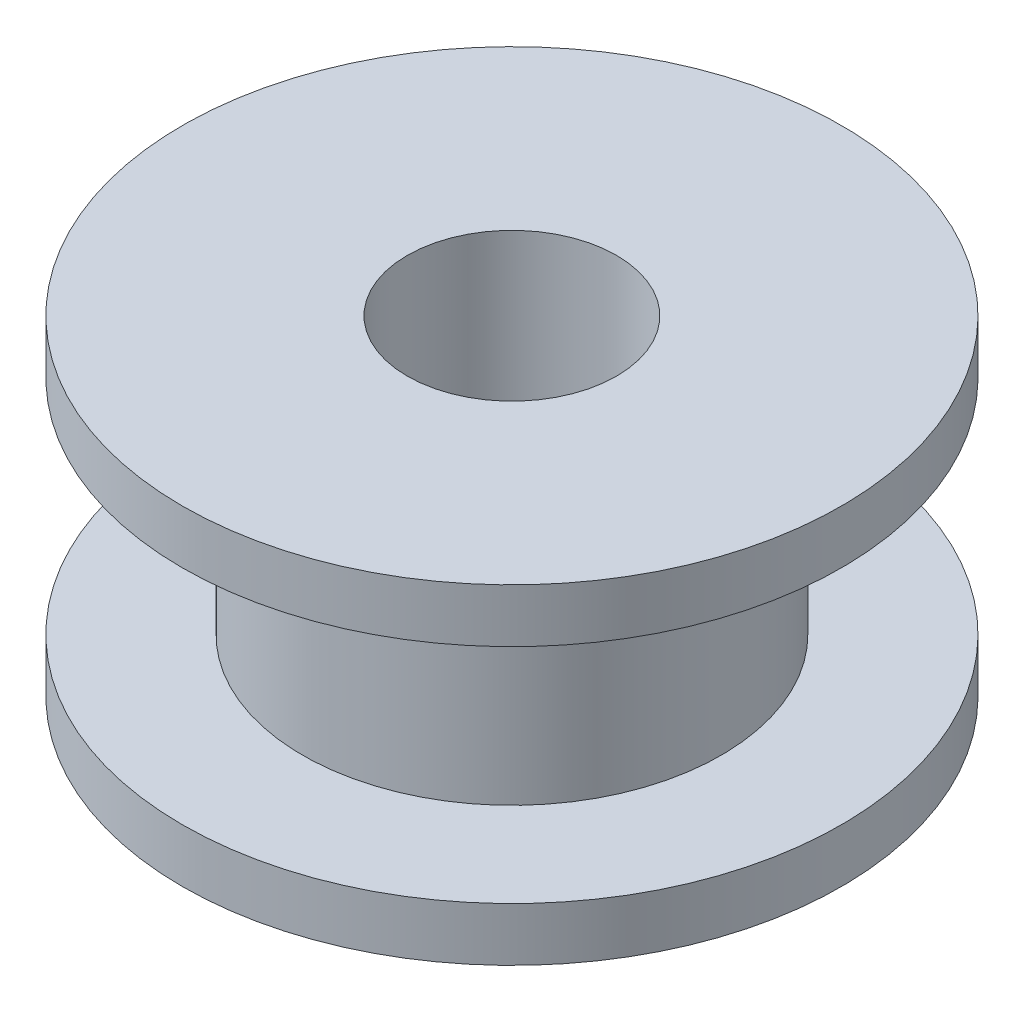
ISO-10303-21;
HEADER;
FILE_DESCRIPTION(('STEP AP214'),'2;1');
FILE_NAME('part.step','',(''),(''),'','','');
FILE_SCHEMA(('AUTOMOTIVE_DESIGN { 1 0 10303 214 1 1 1 1 }'));
ENDSEC;
DATA;
#1=APPLICATION_CONTEXT('core data for automotive mechanical design processes');
#2=APPLICATION_PROTOCOL_DEFINITION('international standard','automotive_design',2000,#1);
#3=PRODUCT_CONTEXT('',#1,'mechanical');
#4=PRODUCT('Part','Part','',(#3));
#5=PRODUCT_RELATED_PRODUCT_CATEGORY('part','',(#4));
#6=PRODUCT_DEFINITION_FORMATION('','',#4);
#7=PRODUCT_DEFINITION_CONTEXT('part definition',#1,'design');
#8=PRODUCT_DEFINITION('design','',#6,#7);
#9=PRODUCT_DEFINITION_SHAPE('','',#8);
#10=(LENGTH_UNIT() NAMED_UNIT(*) SI_UNIT(.MILLI.,.METRE.));
#11=(NAMED_UNIT(*) PLANE_ANGLE_UNIT() SI_UNIT($,.RADIAN.));
#12=(NAMED_UNIT(*) SI_UNIT($,.STERADIAN.) SOLID_ANGLE_UNIT());
#13=UNCERTAINTY_MEASURE_WITH_UNIT(LENGTH_MEASURE(1.E-05),#10,'distance_accuracy_value','');
#14=(GEOMETRIC_REPRESENTATION_CONTEXT(3) GLOBAL_UNCERTAINTY_ASSIGNED_CONTEXT((#13)) GLOBAL_UNIT_ASSIGNED_CONTEXT((#10,
#11,#12)) REPRESENTATION_CONTEXT('',''));
#15=CARTESIAN_POINT('',(0.,0.,0.));
#16=DIRECTION('',(0.,0.,1.));
#17=DIRECTION('',(1.,0.,0.));
#18=AXIS2_PLACEMENT_3D('',#15,#16,#17);
#19=CARTESIAN_POINT('',(0.,8.,0.));
#20=DIRECTION('',(0.,-1.,0.));
#21=DIRECTION('',(0.,0.,-1.));
#22=AXIS2_PLACEMENT_3D('',#19,#20,#21);
#23=CYLINDRICAL_SURFACE('',#22,8.);
#24=CARTESIAN_POINT('',(0.,0.,0.));
#25=DIRECTION('',(0.,1.,0.));
#26=DIRECTION('',(0.,0.,1.));
#27=AXIS2_PLACEMENT_3D('',#24,#25,#26);
#28=CIRCLE('',#27,8.);
#29=CARTESIAN_POINT('',(0.,0.,8.));
#30=VERTEX_POINT('',#29);
#31=EDGE_CURVE('E41',#30,#30,#28,.T.);
#32=ORIENTED_EDGE('',*,*,#31,.T.);
#33=EDGE_LOOP('',(#32));
#34=FACE_BOUND('',#33,.T.);
#35=CARTESIAN_POINT('',(0.,1.3,0.));
#36=DIRECTION('',(0.,1.,0.));
#37=DIRECTION('',(0.,0.,1.));
#38=AXIS2_PLACEMENT_3D('',#35,#36,#37);
#39=CIRCLE('',#38,8.);
#40=CARTESIAN_POINT('',(0.,1.3,8.));
#41=VERTEX_POINT('',#40);
#42=EDGE_CURVE('E56',#41,#41,#39,.T.);
#43=ORIENTED_EDGE('',*,*,#42,.F.);
#44=EDGE_LOOP('',(#43));
#45=FACE_BOUND('',#44,.T.);
#46=ADVANCED_FACE('F37',(#34,#45),#23,.T.);
#47=CARTESIAN_POINT('',(0.,8.,0.));
#48=DIRECTION('',(0.,1.,0.));
#49=DIRECTION('',(0.,0.,1.));
#50=AXIS2_PLACEMENT_3D('',#47,#48,#49);
#51=PLANE('',#50);
#52=CARTESIAN_POINT('',(0.,8.,0.));
#53=DIRECTION('',(0.,1.,0.));
#54=DIRECTION('',(0.,0.,1.));
#55=AXIS2_PLACEMENT_3D('',#52,#53,#54);
#56=CIRCLE('',#55,8.);
#57=CARTESIAN_POINT('',(0.,8.,8.));
#58=VERTEX_POINT('',#57);
#59=EDGE_CURVE('E10',#58,#58,#56,.T.);
#60=ORIENTED_EDGE('',*,*,#59,.T.);
#61=EDGE_LOOP('',(#60));
#62=FACE_BOUND('',#61,.T.);
#63=CARTESIAN_POINT('',(0.,8.,0.));
#64=DIRECTION('',(0.,1.,0.));
#65=DIRECTION('',(0.,0.,1.));
#66=AXIS2_PLACEMENT_3D('',#63,#64,#65);
#67=CIRCLE('',#66,2.54);
#68=CARTESIAN_POINT('',(0.,8.,2.54));
#69=VERTEX_POINT('',#68);
#70=EDGE_CURVE('E48',#69,#69,#67,.T.);
#71=ORIENTED_EDGE('',*,*,#70,.F.);
#72=EDGE_LOOP('',(#71));
#73=FACE_BOUND('',#72,.T.);
#74=ADVANCED_FACE('F88',(#62,#73),#51,.T.);
#75=CARTESIAN_POINT('',(0.,0.,0.));
#76=DIRECTION('',(0.,1.,0.));
#77=DIRECTION('',(0.,0.,1.));
#78=AXIS2_PLACEMENT_3D('',#75,#76,#77);
#79=PLANE('',#78);
#80=ORIENTED_EDGE('',*,*,#31,.F.);
#81=EDGE_LOOP('',(#80));
#82=FACE_BOUND('',#81,.T.);
#83=CARTESIAN_POINT('',(0.,0.,0.));
#84=DIRECTION('',(0.,1.,0.));
#85=DIRECTION('',(0.,0.,1.));
#86=AXIS2_PLACEMENT_3D('',#83,#84,#85);
#87=CIRCLE('',#86,2.54);
#88=CARTESIAN_POINT('',(0.,0.,2.54));
#89=VERTEX_POINT('',#88);
#90=EDGE_CURVE('E50',#89,#89,#87,.T.);
#91=ORIENTED_EDGE('',*,*,#90,.T.);
#92=EDGE_LOOP('',(#91));
#93=FACE_BOUND('',#92,.T.);
#94=ADVANCED_FACE('F95',(#82,#93),#79,.F.);
#95=CARTESIAN_POINT('',(0.,6.7,0.));
#96=DIRECTION('',(0.,1.,0.));
#97=DIRECTION('',(0.,0.,1.));
#98=AXIS2_PLACEMENT_3D('',#95,#96,#97);
#99=CIRCLE('',#98,8.);
#100=CARTESIAN_POINT('',(0.,6.7,8.));
#101=VERTEX_POINT('',#100);
#102=EDGE_CURVE('E53',#101,#101,#99,.T.);
#103=ORIENTED_EDGE('',*,*,#102,.T.);
#104=EDGE_LOOP('',(#103));
#105=FACE_BOUND('',#104,.T.);
#106=ORIENTED_EDGE('',*,*,#59,.F.);
#107=EDGE_LOOP('',(#106));
#108=FACE_BOUND('',#107,.T.);
#109=ADVANCED_FACE('F39',(#105,#108),#23,.T.);
#110=CARTESIAN_POINT('',(0.,8.,0.));
#111=DIRECTION('',(0.,-1.,0.));
#112=DIRECTION('',(0.,0.,-1.));
#113=AXIS2_PLACEMENT_3D('',#110,#111,#112);
#114=CYLINDRICAL_SURFACE('',#113,2.54);
#115=ORIENTED_EDGE('',*,*,#70,.T.);
#116=EDGE_LOOP('',(#115));
#117=FACE_BOUND('',#116,.T.);
#118=ORIENTED_EDGE('',*,*,#90,.F.);
#119=EDGE_LOOP('',(#118));
#120=FACE_BOUND('',#119,.T.);
#121=ADVANCED_FACE('F83',(#117,#120),#114,.F.);
#122=CARTESIAN_POINT('',(0.,6.7,0.));
#123=DIRECTION('',(0.,1.,0.));
#124=DIRECTION('',(0.,0.,1.));
#125=AXIS2_PLACEMENT_3D('',#122,#123,#124);
#126=PLANE('',#125);
#127=ORIENTED_EDGE('',*,*,#102,.F.);
#128=EDGE_LOOP('',(#127));
#129=FACE_BOUND('',#128,.T.);
#130=CARTESIAN_POINT('',(0.,6.7,0.));
#131=DIRECTION('',(0.,1.,0.));
#132=DIRECTION('',(0.,0.,1.));
#133=AXIS2_PLACEMENT_3D('',#130,#131,#132);
#134=CIRCLE('',#133,5.08);
#135=CARTESIAN_POINT('',(0.,6.7,-5.08));
#136=VERTEX_POINT('',#135);
#137=EDGE_CURVE('E59',#136,#136,#134,.T.);
#138=ORIENTED_EDGE('',*,*,#137,.T.);
#139=EDGE_LOOP('',(#138));
#140=FACE_BOUND('',#139,.T.);
#141=ADVANCED_FACE('F68',(#129,#140),#126,.F.);
#142=CARTESIAN_POINT('',(0.,1.3,0.));
#143=DIRECTION('',(0.,1.,0.));
#144=DIRECTION('',(0.,0.,1.));
#145=AXIS2_PLACEMENT_3D('',#142,#143,#144);
#146=PLANE('',#145);
#147=ORIENTED_EDGE('',*,*,#42,.T.);
#148=EDGE_LOOP('',(#147));
#149=FACE_BOUND('',#148,.T.);
#150=CARTESIAN_POINT('',(0.,1.3,0.));
#151=DIRECTION('',(0.,1.,0.));
#152=DIRECTION('',(0.,0.,1.));
#153=AXIS2_PLACEMENT_3D('',#150,#151,#152);
#154=CIRCLE('',#153,5.08);
#155=CARTESIAN_POINT('',(0.,1.3,-5.08));
#156=VERTEX_POINT('',#155);
#157=EDGE_CURVE('E62',#156,#156,#154,.T.);
#158=ORIENTED_EDGE('',*,*,#157,.F.);
#159=EDGE_LOOP('',(#158));
#160=FACE_BOUND('',#159,.T.);
#161=ADVANCED_FACE('F73',(#149,#160),#146,.T.);
#162=CARTESIAN_POINT('',(0.,6.7,0.));
#163=DIRECTION('',(0.,-1.,0.));
#164=DIRECTION('',(0.,0.,-1.));
#165=AXIS2_PLACEMENT_3D('',#162,#163,#164);
#166=CYLINDRICAL_SURFACE('',#165,5.08);
#167=CARTESIAN_POINT('',(0.,6.7,-5.08));
#168=CARTESIAN_POINT('',(0.,6.64375,-5.08));
#169=CARTESIAN_POINT('',(0.,6.5875,-5.08));
#170=CARTESIAN_POINT('',(0.,6.475,-5.08));
#171=CARTESIAN_POINT('',(0.,6.41875,-5.08));
#172=CARTESIAN_POINT('',(0.,6.30625,-5.08));
#173=CARTESIAN_POINT('',(0.,6.25,-5.08));
#174=CARTESIAN_POINT('',(0.,6.1375,-5.08));
#175=CARTESIAN_POINT('',(0.,6.08125,-5.08));
#176=CARTESIAN_POINT('',(0.,5.96875,-5.08));
#177=CARTESIAN_POINT('',(0.,5.9125,-5.08));
#178=CARTESIAN_POINT('',(0.,5.8,-5.08));
#179=CARTESIAN_POINT('',(0.,5.74375,-5.08));
#180=CARTESIAN_POINT('',(0.,5.63125,-5.08));
#181=CARTESIAN_POINT('',(0.,5.575,-5.08));
#182=CARTESIAN_POINT('',(0.,5.4625,-5.08));
#183=CARTESIAN_POINT('',(0.,5.40625,-5.08));
#184=CARTESIAN_POINT('',(0.,5.29375,-5.08));
#185=CARTESIAN_POINT('',(0.,5.2375,-5.08));
#186=CARTESIAN_POINT('',(0.,5.125,-5.08));
#187=CARTESIAN_POINT('',(0.,5.06875,-5.08));
#188=CARTESIAN_POINT('',(0.,4.95625,-5.08));
#189=CARTESIAN_POINT('',(0.,4.9,-5.08));
#190=CARTESIAN_POINT('',(0.,4.7875,-5.08));
#191=CARTESIAN_POINT('',(0.,4.73125,-5.08));
#192=CARTESIAN_POINT('',(0.,4.61875,-5.08));
#193=CARTESIAN_POINT('',(0.,4.5625,-5.08));
#194=CARTESIAN_POINT('',(0.,4.45,-5.08));
#195=CARTESIAN_POINT('',(0.,4.39375,-5.08));
#196=CARTESIAN_POINT('',(0.,4.28125,-5.08));
#197=CARTESIAN_POINT('',(0.,4.225,-5.08));
#198=CARTESIAN_POINT('',(0.,4.1125,-5.08));
#199=CARTESIAN_POINT('',(0.,4.05625,-5.08));
#200=CARTESIAN_POINT('',(0.,3.94375,-5.08));
#201=CARTESIAN_POINT('',(0.,3.8875,-5.08));
#202=CARTESIAN_POINT('',(0.,3.775,-5.08));
#203=CARTESIAN_POINT('',(0.,3.71875,-5.08));
#204=CARTESIAN_POINT('',(0.,3.60625,-5.08));
#205=CARTESIAN_POINT('',(0.,3.55,-5.08));
#206=CARTESIAN_POINT('',(0.,3.4375,-5.08));
#207=CARTESIAN_POINT('',(0.,3.38125,-5.08));
#208=CARTESIAN_POINT('',(0.,3.26875,-5.08));
#209=CARTESIAN_POINT('',(0.,3.2125,-5.08));
#210=CARTESIAN_POINT('',(0.,3.1,-5.08));
#211=CARTESIAN_POINT('',(0.,3.04375,-5.08));
#212=CARTESIAN_POINT('',(0.,2.93125,-5.08));
#213=CARTESIAN_POINT('',(0.,2.875,-5.08));
#214=CARTESIAN_POINT('',(0.,2.7625,-5.08));
#215=CARTESIAN_POINT('',(0.,2.70625,-5.08));
#216=CARTESIAN_POINT('',(0.,2.59375,-5.08));
#217=CARTESIAN_POINT('',(0.,2.5375,-5.08));
#218=CARTESIAN_POINT('',(0.,2.425,-5.08));
#219=CARTESIAN_POINT('',(0.,2.36875,-5.08));
#220=CARTESIAN_POINT('',(0.,2.25625,-5.08));
#221=CARTESIAN_POINT('',(0.,2.2,-5.08));
#222=CARTESIAN_POINT('',(0.,2.0875,-5.08));
#223=CARTESIAN_POINT('',(0.,2.03125,-5.08));
#224=CARTESIAN_POINT('',(0.,1.91875,-5.08));
#225=CARTESIAN_POINT('',(0.,1.8625,-5.08));
#226=CARTESIAN_POINT('',(0.,1.75,-5.08));
#227=CARTESIAN_POINT('',(0.,1.69375,-5.08));
#228=CARTESIAN_POINT('',(0.,1.58125,-5.08));
#229=CARTESIAN_POINT('',(0.,1.525,-5.08));
#230=CARTESIAN_POINT('',(0.,1.4125,-5.08));
#231=CARTESIAN_POINT('',(0.,1.35625,-5.08));
#232=CARTESIAN_POINT('',(0.,1.3,-5.08));
#233=B_SPLINE_CURVE_WITH_KNOTS('',3,(#167,#168,#169,#170,#171,#172,#173,#174,#175,#176,#177,
#178,#179,#180,#181,#182,#183,#184,#185,#186,#187,#188,#189,#190,#191,#192,#193,#194,#195,#196,
#197,#198,#199,#200,#201,#202,#203,#204,#205,#206,#207,#208,#209,#210,#211,#212,#213,#214,#215,
#216,#217,#218,#219,#220,#221,#222,#223,#224,#225,#226,#227,#228,#229,#230,#231,#232),
.UNSPECIFIED.,.F.,.F.,(4,2,2,2,2,2,2,2,2,2,2,2,2,2,2,2,2,2,2,2,2,2,2,2,2,2,2,2,2,2,2,2,4),(0.,
0.16875,0.337499999999999,0.50625,0.674999999999999,0.84375,1.0125,1.18125,1.35,1.51875,1.6875,
1.85625,2.025,2.19375,2.3625,2.53125,2.7,2.86875,3.0375,3.20625,3.375,3.54375,3.7125,3.88125,
4.05,4.21875,4.3875,4.55625,4.725,4.89375,5.0625,5.23125,5.4),.UNSPECIFIED.);
#234=EDGE_CURVE('BSEAM70',#136,#156,#233,.T.);
#235=ORIENTED_EDGE('',*,*,#137,.F.);
#236=ORIENTED_EDGE('',*,*,#157,.T.);
#237=ORIENTED_EDGE('',*,*,#234,.T.);
#238=ORIENTED_EDGE('',*,*,#234,.F.);
#239=EDGE_LOOP('',(#235,#237,#236,#238));
#240=FACE_BOUND('',#239,.T.);
#241=ADVANCED_FACE('F70',(#240),#166,.T.);
#242=CLOSED_SHELL('',(#46,#74,#94,#109,#121,#141,#161,#241));
#243=MANIFOLD_SOLID_BREP('B2',#242);
#244=ADVANCED_BREP_SHAPE_REPRESENTATION('',(#18,#243),#14);
#245=SHAPE_DEFINITION_REPRESENTATION(#9,#244);
ENDSEC;
END-ISO-10303-21;
